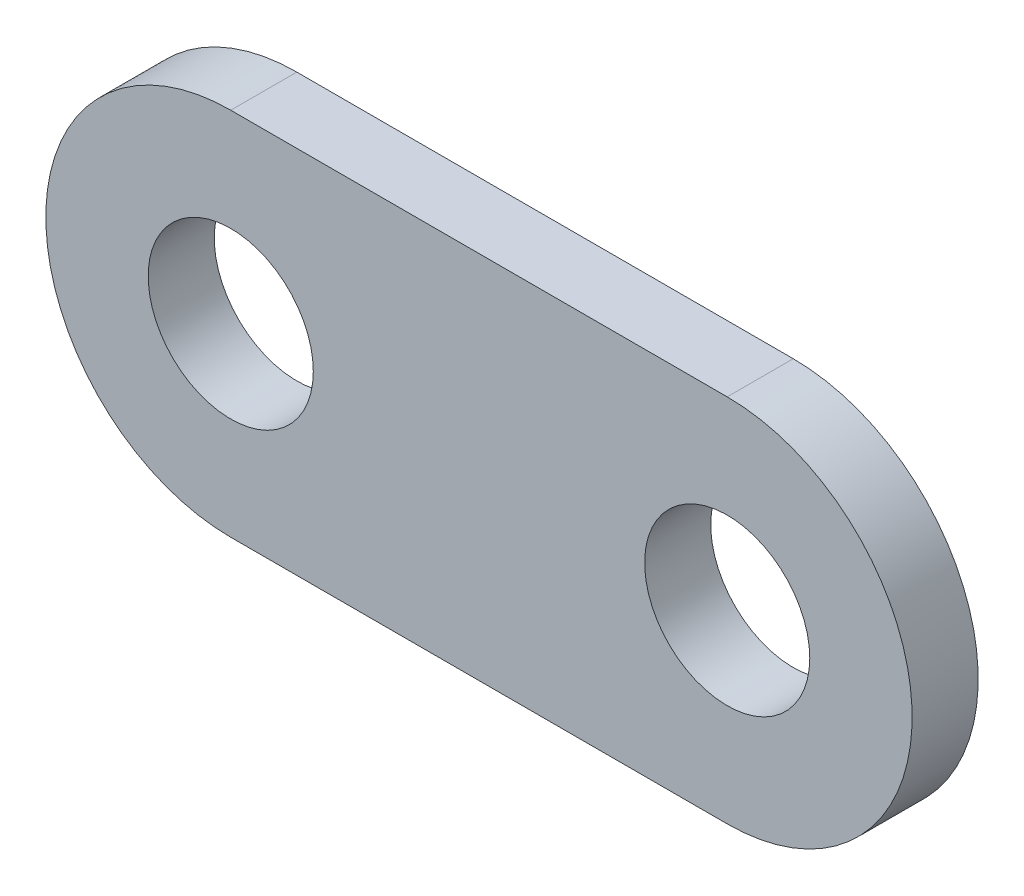
ISO-10303-21;
HEADER;
FILE_DESCRIPTION(('STEP AP214'),'2;1');
FILE_NAME('part.step','',(''),(''),'','','');
FILE_SCHEMA(('AUTOMOTIVE_DESIGN { 1 0 10303 214 1 1 1 1 }'));
ENDSEC;
DATA;
#1=APPLICATION_CONTEXT('core data for automotive mechanical design processes');
#2=APPLICATION_PROTOCOL_DEFINITION('international standard','automotive_design',2000,#1);
#3=PRODUCT_CONTEXT('',#1,'mechanical');
#4=PRODUCT('Part','Part','',(#3));
#5=PRODUCT_RELATED_PRODUCT_CATEGORY('part','',(#4));
#6=PRODUCT_DEFINITION_FORMATION('','',#4);
#7=PRODUCT_DEFINITION_CONTEXT('part definition',#1,'design');
#8=PRODUCT_DEFINITION('design','',#6,#7);
#9=PRODUCT_DEFINITION_SHAPE('','',#8);
#10=(LENGTH_UNIT() NAMED_UNIT(*) SI_UNIT(.MILLI.,.METRE.));
#11=(NAMED_UNIT(*) PLANE_ANGLE_UNIT() SI_UNIT($,.RADIAN.));
#12=(NAMED_UNIT(*) SI_UNIT($,.STERADIAN.) SOLID_ANGLE_UNIT());
#13=UNCERTAINTY_MEASURE_WITH_UNIT(LENGTH_MEASURE(1.E-05),#10,'distance_accuracy_value','');
#14=(GEOMETRIC_REPRESENTATION_CONTEXT(3) GLOBAL_UNCERTAINTY_ASSIGNED_CONTEXT((#13)) GLOBAL_UNIT_ASSIGNED_CONTEXT((#10,
#11,#12)) REPRESENTATION_CONTEXT('',''));
#15=CARTESIAN_POINT('',(0.,0.,0.));
#16=DIRECTION('',(0.,0.,1.));
#17=DIRECTION('',(1.,0.,0.));
#18=AXIS2_PLACEMENT_3D('',#15,#16,#17);
#19=CARTESIAN_POINT('',(3.75851817562313,-97.5151932028288,1.));
#20=DIRECTION('',(0.,0.,-1.));
#21=DIRECTION('',(-1.,0.,0.));
#22=AXIS2_PLACEMENT_3D('',#19,#20,#21);
#23=PLANE('',#22);
#24=CARTESIAN_POINT('',(3.75851817562313,-97.5151932028288,1.));
#25=DIRECTION('',(0.,0.,1.));
#26=DIRECTION('',(-1.,0.,0.));
#27=AXIS2_PLACEMENT_3D('',#24,#25,#26);
#28=CIRCLE('',#27,2.79999999999826);
#29=CARTESIAN_POINT('',(3.75851817562313,-100.315193202827,1.));
#30=VERTEX_POINT('',#29);
#31=CARTESIAN_POINT('',(3.75851817562313,-94.7151932028305,1.));
#32=VERTEX_POINT('',#31);
#33=EDGE_CURVE('E87',#30,#32,#28,.T.);
#34=ORIENTED_EDGE('',*,*,#33,.T.);
#35=DIRECTION('',(-1.,0.,0.));
#36=VECTOR('',#35,1.);
#37=CARTESIAN_POINT('',(3.75851817562313,-94.7151932028305,1.));
#38=LINE('',#37,#36);
#39=CARTESIAN_POINT('',(-3.75851817562296,-94.7151932028305,1.));
#40=VERTEX_POINT('',#39);
#41=EDGE_CURVE('E82',#32,#40,#38,.T.);
#42=ORIENTED_EDGE('',*,*,#41,.T.);
#43=CARTESIAN_POINT('',(-3.75851817562296,-97.5151932028288,1.));
#44=DIRECTION('',(0.,0.,1.));
#45=DIRECTION('',(1.,0.,0.));
#46=AXIS2_PLACEMENT_3D('',#43,#44,#45);
#47=CIRCLE('',#46,2.79999999999827);
#48=CARTESIAN_POINT('',(-3.75851817562296,-100.315193202827,1.));
#49=VERTEX_POINT('',#48);
#50=EDGE_CURVE('E85',#40,#49,#47,.T.);
#51=ORIENTED_EDGE('',*,*,#50,.T.);
#52=DIRECTION('',(1.,0.,0.));
#53=VECTOR('',#52,1.);
#54=CARTESIAN_POINT('',(3.75851817562313,-100.315193202827,1.));
#55=LINE('',#54,#53);
#56=EDGE_CURVE('E52',#49,#30,#55,.T.);
#57=ORIENTED_EDGE('',*,*,#56,.T.);
#58=EDGE_LOOP('',(#34,#42,#51,#57));
#59=FACE_BOUND('',#58,.T.);
#60=CARTESIAN_POINT('',(3.75851817562313,-97.5151932028288,1.));
#61=DIRECTION('',(0.,0.,1.));
#62=DIRECTION('',(1.,0.,0.));
#63=AXIS2_PLACEMENT_3D('',#60,#61,#62);
#64=CIRCLE('',#63,1.250000002142);
#65=CARTESIAN_POINT('',(5.00851817776513,-97.5151932028288,1.));
#66=VERTEX_POINT('',#65);
#67=EDGE_CURVE('E102',#66,#66,#64,.T.);
#68=ORIENTED_EDGE('',*,*,#67,.F.);
#69=EDGE_LOOP('',(#68));
#70=FACE_BOUND('',#69,.T.);
#71=CARTESIAN_POINT('',(-3.75851817562296,-97.5151932028288,1.));
#72=DIRECTION('',(0.,0.,1.));
#73=DIRECTION('',(1.,0.,0.));
#74=AXIS2_PLACEMENT_3D('',#71,#72,#73);
#75=CIRCLE('',#74,1.25);
#76=CARTESIAN_POINT('',(-2.50851817562296,-97.5151932028288,1.));
#77=VERTEX_POINT('',#76);
#78=EDGE_CURVE('E117',#77,#77,#75,.T.);
#79=ORIENTED_EDGE('',*,*,#78,.F.);
#80=EDGE_LOOP('',(#79));
#81=FACE_BOUND('',#80,.T.);
#82=ADVANCED_FACE('F35',(#59,#70,#81),#23,.F.);
#83=CARTESIAN_POINT('',(3.75851817562313,-97.5151932028288,0.));
#84=DIRECTION('',(0.,0.,-1.));
#85=DIRECTION('',(-1.,0.,0.));
#86=AXIS2_PLACEMENT_3D('',#83,#84,#85);
#87=PLANE('',#86);
#88=CARTESIAN_POINT('',(3.75851817562313,-97.5151932028288,0.));
#89=DIRECTION('',(0.,0.,1.));
#90=DIRECTION('',(1.,0.,0.));
#91=AXIS2_PLACEMENT_3D('',#88,#89,#90);
#92=CIRCLE('',#91,1.250000002142);
#93=CARTESIAN_POINT('',(5.00851817776513,-97.5151932028288,0.));
#94=VERTEX_POINT('',#93);
#95=EDGE_CURVE('E114',#94,#94,#92,.T.);
#96=ORIENTED_EDGE('',*,*,#95,.T.);
#97=EDGE_LOOP('',(#96));
#98=FACE_BOUND('',#97,.T.);
#99=CARTESIAN_POINT('',(3.75851817562313,-97.5151932028288,0.));
#100=DIRECTION('',(0.,0.,1.));
#101=DIRECTION('',(-1.,0.,0.));
#102=AXIS2_PLACEMENT_3D('',#99,#100,#101);
#103=CIRCLE('',#102,2.79999999999826);
#104=CARTESIAN_POINT('',(3.75851817562313,-100.315193202827,0.));
#105=VERTEX_POINT('',#104);
#106=CARTESIAN_POINT('',(3.75851817562313,-94.7151932028305,0.));
#107=VERTEX_POINT('',#106);
#108=EDGE_CURVE('E99',#105,#107,#103,.T.);
#109=ORIENTED_EDGE('',*,*,#108,.F.);
#110=DIRECTION('',(1.,0.,0.));
#111=VECTOR('',#110,1.);
#112=CARTESIAN_POINT('',(3.75851817562313,-100.315193202827,0.));
#113=LINE('',#112,#111);
#114=CARTESIAN_POINT('',(-3.75851817562296,-100.315193202827,0.));
#115=VERTEX_POINT('',#114);
#116=EDGE_CURVE('E75',#115,#105,#113,.T.);
#117=ORIENTED_EDGE('',*,*,#116,.F.);
#118=CARTESIAN_POINT('',(-3.75851817562296,-97.5151932028288,0.));
#119=DIRECTION('',(0.,0.,1.));
#120=DIRECTION('',(1.,0.,0.));
#121=AXIS2_PLACEMENT_3D('',#118,#119,#120);
#122=CIRCLE('',#121,2.79999999999827);
#123=CARTESIAN_POINT('',(-3.75851817562296,-94.7151932028305,0.));
#124=VERTEX_POINT('',#123);
#125=EDGE_CURVE('E69',#124,#115,#122,.T.);
#126=ORIENTED_EDGE('',*,*,#125,.F.);
#127=DIRECTION('',(-1.,0.,0.));
#128=VECTOR('',#127,1.);
#129=CARTESIAN_POINT('',(3.75851817562313,-94.7151932028305,0.));
#130=LINE('',#129,#128);
#131=EDGE_CURVE('E91',#107,#124,#130,.T.);
#132=ORIENTED_EDGE('',*,*,#131,.F.);
#133=EDGE_LOOP('',(#109,#117,#126,#132));
#134=FACE_BOUND('',#133,.T.);
#135=CARTESIAN_POINT('',(-3.75851817562296,-97.5151932028288,0.));
#136=DIRECTION('',(0.,0.,1.));
#137=DIRECTION('',(1.,0.,0.));
#138=AXIS2_PLACEMENT_3D('',#135,#136,#137);
#139=CIRCLE('',#138,1.25);
#140=CARTESIAN_POINT('',(-2.50851817562296,-97.5151932028288,0.));
#141=VERTEX_POINT('',#140);
#142=EDGE_CURVE('E120',#141,#141,#139,.T.);
#143=ORIENTED_EDGE('',*,*,#142,.T.);
#144=EDGE_LOOP('',(#143));
#145=FACE_BOUND('',#144,.T.);
#146=ADVANCED_FACE('F110',(#98,#134,#145),#87,.T.);
#147=CARTESIAN_POINT('',(3.75851817562313,-97.5151932028288,1.));
#148=DIRECTION('',(0.,0.,-1.));
#149=DIRECTION('',(-1.,0.,0.));
#150=AXIS2_PLACEMENT_3D('',#147,#148,#149);
#151=CYLINDRICAL_SURFACE('',#150,2.79999999999826);
#152=ORIENTED_EDGE('',*,*,#108,.T.);
#153=DIRECTION('',(0.,0.,-1.));
#154=VECTOR('',#153,1.);
#155=CARTESIAN_POINT('',(3.75851817562313,-94.7151932028305,1.));
#156=LINE('',#155,#154);
#157=EDGE_CURVE('E11',#32,#107,#156,.T.);
#158=ORIENTED_EDGE('',*,*,#157,.F.);
#159=ORIENTED_EDGE('',*,*,#33,.F.);
#160=DIRECTION('',(0.,0.,-1.));
#161=VECTOR('',#160,1.);
#162=CARTESIAN_POINT('',(3.75851817562313,-100.315193202827,1.));
#163=LINE('',#162,#161);
#164=EDGE_CURVE('E95',#30,#105,#163,.T.);
#165=ORIENTED_EDGE('',*,*,#164,.T.);
#166=EDGE_LOOP('',(#152,#158,#159,#165));
#167=FACE_BOUND('',#166,.T.);
#168=ADVANCED_FACE('F37',(#167),#151,.T.);
#169=CARTESIAN_POINT('',(3.75851817562313,-94.7151932028305,1.));
#170=DIRECTION('',(0.,-1.,0.));
#171=DIRECTION('',(0.,0.,-1.));
#172=AXIS2_PLACEMENT_3D('',#169,#170,#171);
#173=PLANE('',#172);
#174=ORIENTED_EDGE('',*,*,#131,.T.);
#175=DIRECTION('',(0.,0.,-1.));
#176=VECTOR('',#175,1.);
#177=CARTESIAN_POINT('',(-3.75851817562296,-94.7151932028305,1.));
#178=LINE('',#177,#176);
#179=EDGE_CURVE('E44',#40,#124,#178,.T.);
#180=ORIENTED_EDGE('',*,*,#179,.F.);
#181=ORIENTED_EDGE('',*,*,#41,.F.);
#182=ORIENTED_EDGE('',*,*,#157,.T.);
#183=EDGE_LOOP('',(#174,#180,#181,#182));
#184=FACE_BOUND('',#183,.T.);
#185=ADVANCED_FACE('F90',(#184),#173,.F.);
#186=CARTESIAN_POINT('',(-3.75851817562296,-97.5151932028288,1.));
#187=DIRECTION('',(0.,0.,-1.));
#188=DIRECTION('',(-1.,0.,0.));
#189=AXIS2_PLACEMENT_3D('',#186,#187,#188);
#190=CYLINDRICAL_SURFACE('',#189,2.79999999999827);
#191=ORIENTED_EDGE('',*,*,#125,.T.);
#192=DIRECTION('',(0.,0.,-1.));
#193=VECTOR('',#192,1.);
#194=CARTESIAN_POINT('',(-3.75851817562296,-100.315193202827,1.));
#195=LINE('',#194,#193);
#196=EDGE_CURVE('E92',#49,#115,#195,.T.);
#197=ORIENTED_EDGE('',*,*,#196,.F.);
#198=ORIENTED_EDGE('',*,*,#50,.F.);
#199=ORIENTED_EDGE('',*,*,#179,.T.);
#200=EDGE_LOOP('',(#191,#197,#198,#199));
#201=FACE_BOUND('',#200,.T.);
#202=ADVANCED_FACE('F93',(#201),#190,.T.);
#203=CARTESIAN_POINT('',(3.75851817562313,-100.315193202827,1.));
#204=DIRECTION('',(0.,1.,0.));
#205=DIRECTION('',(-1.,0.,0.));
#206=AXIS2_PLACEMENT_3D('',#203,#204,#205);
#207=PLANE('',#206);
#208=ORIENTED_EDGE('',*,*,#116,.T.);
#209=ORIENTED_EDGE('',*,*,#164,.F.);
#210=ORIENTED_EDGE('',*,*,#56,.F.);
#211=ORIENTED_EDGE('',*,*,#196,.T.);
#212=EDGE_LOOP('',(#208,#209,#210,#211));
#213=FACE_BOUND('',#212,.T.);
#214=ADVANCED_FACE('F107',(#213),#207,.F.);
#215=CARTESIAN_POINT('',(3.75851817562313,-97.5151932028288,1.));
#216=DIRECTION('',(0.,0.,-1.));
#217=DIRECTION('',(-1.,0.,0.));
#218=AXIS2_PLACEMENT_3D('',#215,#216,#217);
#219=CYLINDRICAL_SURFACE('',#218,1.250000002142);
#220=ORIENTED_EDGE('',*,*,#67,.T.);
#221=EDGE_LOOP('',(#220));
#222=FACE_BOUND('',#221,.T.);
#223=ORIENTED_EDGE('',*,*,#95,.F.);
#224=EDGE_LOOP('',(#223));
#225=FACE_BOUND('',#224,.T.);
#226=ADVANCED_FACE('F137',(#222,#225),#219,.F.);
#227=CARTESIAN_POINT('',(-3.75851817562296,-97.5151932028288,1.));
#228=DIRECTION('',(0.,0.,-1.));
#229=DIRECTION('',(-1.,0.,0.));
#230=AXIS2_PLACEMENT_3D('',#227,#228,#229);
#231=CYLINDRICAL_SURFACE('',#230,1.25);
#232=ORIENTED_EDGE('',*,*,#78,.T.);
#233=EDGE_LOOP('',(#232));
#234=FACE_BOUND('',#233,.T.);
#235=ORIENTED_EDGE('',*,*,#142,.F.);
#236=EDGE_LOOP('',(#235));
#237=FACE_BOUND('',#236,.T.);
#238=ADVANCED_FACE('F126',(#234,#237),#231,.F.);
#239=CLOSED_SHELL('',(#82,#146,#168,#185,#202,#214,#226,#238));
#240=MANIFOLD_SOLID_BREP('B2',#239);
#241=ADVANCED_BREP_SHAPE_REPRESENTATION('',(#18,#240),#14);
#242=SHAPE_DEFINITION_REPRESENTATION(#9,#241);
ENDSEC;
END-ISO-10303-21;
